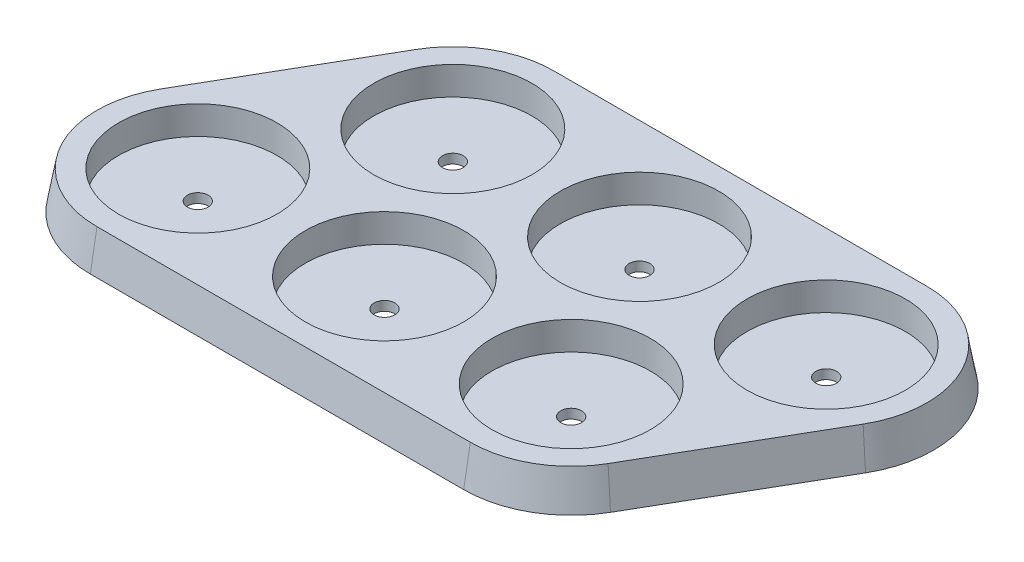
ISO-10303-21;
HEADER;
FILE_DESCRIPTION(('STEP AP214'),'2;1');
FILE_NAME('part.step','',(''),(''),'','','');
FILE_SCHEMA(('AUTOMOTIVE_DESIGN { 1 0 10303 214 1 1 1 1 }'));
ENDSEC;
DATA;
#1=APPLICATION_CONTEXT('core data for automotive mechanical design processes');
#2=APPLICATION_PROTOCOL_DEFINITION('international standard','automotive_design',2000,#1);
#3=PRODUCT_CONTEXT('',#1,'mechanical');
#4=PRODUCT('Part','Part','',(#3));
#5=PRODUCT_RELATED_PRODUCT_CATEGORY('part','',(#4));
#6=PRODUCT_DEFINITION_FORMATION('','',#4);
#7=PRODUCT_DEFINITION_CONTEXT('part definition',#1,'design');
#8=PRODUCT_DEFINITION('design','',#6,#7);
#9=PRODUCT_DEFINITION_SHAPE('','',#8);
#10=(LENGTH_UNIT() NAMED_UNIT(*) SI_UNIT(.MILLI.,.METRE.));
#11=(NAMED_UNIT(*) PLANE_ANGLE_UNIT() SI_UNIT($,.RADIAN.));
#12=(NAMED_UNIT(*) SI_UNIT($,.STERADIAN.) SOLID_ANGLE_UNIT());
#13=UNCERTAINTY_MEASURE_WITH_UNIT(LENGTH_MEASURE(1.E-05),#10,'distance_accuracy_value','');
#14=(GEOMETRIC_REPRESENTATION_CONTEXT(3) GLOBAL_UNCERTAINTY_ASSIGNED_CONTEXT((#13)) GLOBAL_UNIT_ASSIGNED_CONTEXT((#10,
#11,#12)) REPRESENTATION_CONTEXT('',''));
#15=CARTESIAN_POINT('',(0.,0.,0.));
#16=DIRECTION('',(0.,0.,1.));
#17=DIRECTION('',(1.,0.,0.));
#18=AXIS2_PLACEMENT_3D('',#15,#16,#17);
#19=CARTESIAN_POINT('',(-9.90000000000008,0.,17.1473029949318));
#20=DIRECTION('',(0.,1.,0.));
#21=DIRECTION('',(0.,0.,1.));
#22=AXIS2_PLACEMENT_3D('',#19,#20,#21);
#23=CYLINDRICAL_SURFACE('',#22,1.1);
#24=CARTESIAN_POINT('',(-9.90000000000008,0.,17.1473029949318));
#25=DIRECTION('',(0.,1.,0.));
#26=DIRECTION('',(0.,0.,1.));
#27=AXIS2_PLACEMENT_3D('',#24,#25,#26);
#28=CIRCLE('',#27,1.1);
#29=CARTESIAN_POINT('',(-9.90000000000008,0.,18.2473029949318));
#30=VERTEX_POINT('',#29);
#31=EDGE_CURVE('E192',#30,#30,#28,.T.);
#32=ORIENTED_EDGE('',*,*,#31,.F.);
#33=EDGE_LOOP('',(#32));
#34=FACE_BOUND('',#33,.T.);
#35=CARTESIAN_POINT('',(-9.90000000000008,1.,17.1473029949318));
#36=DIRECTION('',(0.,1.,0.));
#37=DIRECTION('',(0.,0.,1.));
#38=AXIS2_PLACEMENT_3D('',#35,#36,#37);
#39=CIRCLE('',#38,1.1);
#40=CARTESIAN_POINT('',(-9.90000000000008,1.,18.2473029949318));
#41=VERTEX_POINT('',#40);
#42=EDGE_CURVE('E627',#41,#41,#39,.T.);
#43=ORIENTED_EDGE('',*,*,#42,.T.);
#44=EDGE_LOOP('',(#43));
#45=FACE_BOUND('',#44,.T.);
#46=ADVANCED_FACE('F104',(#34,#45),#23,.F.);
#47=CARTESIAN_POINT('',(-19.7999999999998,0.,0.));
#48=DIRECTION('',(0.,1.,0.));
#49=DIRECTION('',(0.,0.,1.));
#50=AXIS2_PLACEMENT_3D('',#47,#48,#49);
#51=CYLINDRICAL_SURFACE('',#50,1.10000000000001);
#52=CARTESIAN_POINT('',(-19.7999999999998,0.,0.));
#53=DIRECTION('',(0.,1.,0.));
#54=DIRECTION('',(0.,0.,1.));
#55=AXIS2_PLACEMENT_3D('',#52,#53,#54);
#56=CIRCLE('',#55,1.10000000000001);
#57=CARTESIAN_POINT('',(-19.7999999999998,0.,1.10000000000001));
#58=VERTEX_POINT('',#57);
#59=EDGE_CURVE('E659',#58,#58,#56,.T.);
#60=ORIENTED_EDGE('',*,*,#59,.F.);
#61=EDGE_LOOP('',(#60));
#62=FACE_BOUND('',#61,.T.);
#63=CARTESIAN_POINT('',(-19.7999999999998,1.,0.));
#64=DIRECTION('',(0.,1.,0.));
#65=DIRECTION('',(0.,0.,1.));
#66=AXIS2_PLACEMENT_3D('',#63,#64,#65);
#67=CIRCLE('',#66,1.10000000000001);
#68=CARTESIAN_POINT('',(-19.7999999999998,1.,1.10000000000001));
#69=VERTEX_POINT('',#68);
#70=EDGE_CURVE('E649',#69,#69,#67,.T.);
#71=ORIENTED_EDGE('',*,*,#70,.T.);
#72=EDGE_LOOP('',(#71));
#73=FACE_BOUND('',#72,.T.);
#74=ADVANCED_FACE('F287',(#62,#73),#51,.F.);
#75=CARTESIAN_POINT('',(-49.4999999999999,0.,17.1473029949316));
#76=DIRECTION('',(0.,1.,0.));
#77=DIRECTION('',(0.,0.,1.));
#78=AXIS2_PLACEMENT_3D('',#75,#76,#77);
#79=CYLINDRICAL_SURFACE('',#78,1.1);
#80=CARTESIAN_POINT('',(-49.4999999999999,0.,17.1473029949316));
#81=DIRECTION('',(0.,1.,0.));
#82=DIRECTION('',(0.,0.,1.));
#83=AXIS2_PLACEMENT_3D('',#80,#81,#82);
#84=CIRCLE('',#83,1.1);
#85=CARTESIAN_POINT('',(-49.4999999999999,0.,18.2473029949316));
#86=VERTEX_POINT('',#85);
#87=EDGE_CURVE('E666',#86,#86,#84,.T.);
#88=ORIENTED_EDGE('',*,*,#87,.F.);
#89=EDGE_LOOP('',(#88));
#90=FACE_BOUND('',#89,.T.);
#91=CARTESIAN_POINT('',(-49.4999999999999,1.,17.1473029949316));
#92=DIRECTION('',(0.,1.,0.));
#93=DIRECTION('',(0.,0.,1.));
#94=AXIS2_PLACEMENT_3D('',#91,#92,#93);
#95=CIRCLE('',#94,1.1);
#96=CARTESIAN_POINT('',(-49.4999999999999,1.,18.2473029949316));
#97=VERTEX_POINT('',#96);
#98=EDGE_CURVE('E684',#97,#97,#95,.T.);
#99=ORIENTED_EDGE('',*,*,#98,.T.);
#100=EDGE_LOOP('',(#99));
#101=FACE_BOUND('',#100,.T.);
#102=ADVANCED_FACE('F293',(#90,#101),#79,.F.);
#103=CARTESIAN_POINT('',(-39.5999999999999,0.,-2.72581957005969E-13));
#104=DIRECTION('',(0.,1.,0.));
#105=DIRECTION('',(0.,0.,1.));
#106=AXIS2_PLACEMENT_3D('',#103,#104,#105);
#107=CYLINDRICAL_SURFACE('',#106,1.10000000000001);
#108=CARTESIAN_POINT('',(-39.5999999999999,0.,-2.72581957005969E-13));
#109=DIRECTION('',(0.,1.,0.));
#110=DIRECTION('',(0.,0.,1.));
#111=AXIS2_PLACEMENT_3D('',#108,#109,#110);
#112=CIRCLE('',#111,1.10000000000001);
#113=CARTESIAN_POINT('',(-39.5999999999999,0.,1.09999999999974));
#114=VERTEX_POINT('',#113);
#115=EDGE_CURVE('E673',#114,#114,#112,.T.);
#116=ORIENTED_EDGE('',*,*,#115,.F.);
#117=EDGE_LOOP('',(#116));
#118=FACE_BOUND('',#117,.T.);
#119=CARTESIAN_POINT('',(-39.5999999999999,1.,-2.72581957005969E-13));
#120=DIRECTION('',(0.,1.,0.));
#121=DIRECTION('',(0.,0.,1.));
#122=AXIS2_PLACEMENT_3D('',#119,#120,#121);
#123=CIRCLE('',#122,1.10000000000001);
#124=CARTESIAN_POINT('',(-39.5999999999999,1.,1.09999999999974));
#125=VERTEX_POINT('',#124);
#126=EDGE_CURVE('E637',#125,#125,#123,.T.);
#127=ORIENTED_EDGE('',*,*,#126,.T.);
#128=EDGE_LOOP('',(#127));
#129=FACE_BOUND('',#128,.T.);
#130=ADVANCED_FACE('F477',(#118,#129),#107,.F.);
#131=CARTESIAN_POINT('',(-29.6999999999999,0.,17.1473029949318));
#132=DIRECTION('',(0.,1.,0.));
#133=DIRECTION('',(0.,0.,1.));
#134=AXIS2_PLACEMENT_3D('',#131,#132,#133);
#135=CYLINDRICAL_SURFACE('',#134,1.1);
#136=CARTESIAN_POINT('',(-29.6999999999999,0.,17.1473029949318));
#137=DIRECTION('',(0.,1.,0.));
#138=DIRECTION('',(0.,0.,1.));
#139=AXIS2_PLACEMENT_3D('',#136,#137,#138);
#140=CIRCLE('',#139,1.1);
#141=CARTESIAN_POINT('',(-29.6999999999999,0.,18.2473029949318));
#142=VERTEX_POINT('',#141);
#143=EDGE_CURVE('E669',#142,#142,#140,.T.);
#144=ORIENTED_EDGE('',*,*,#143,.F.);
#145=EDGE_LOOP('',(#144));
#146=FACE_BOUND('',#145,.T.);
#147=CARTESIAN_POINT('',(-29.6999999999999,1.,17.1473029949318));
#148=DIRECTION('',(0.,1.,0.));
#149=DIRECTION('',(0.,0.,1.));
#150=AXIS2_PLACEMENT_3D('',#147,#148,#149);
#151=CIRCLE('',#150,1.1);
#152=CARTESIAN_POINT('',(-29.6999999999999,1.,18.2473029949318));
#153=VERTEX_POINT('',#152);
#154=EDGE_CURVE('E629',#153,#153,#151,.T.);
#155=ORIENTED_EDGE('',*,*,#154,.T.);
#156=EDGE_LOOP('',(#155));
#157=FACE_BOUND('',#156,.T.);
#158=ADVANCED_FACE('F485',(#146,#157),#135,.F.);
#159=CARTESIAN_POINT('',(0.,0.,0.));
#160=DIRECTION('',(0.,1.,0.));
#161=DIRECTION('',(0.,0.,1.));
#162=AXIS2_PLACEMENT_3D('',#159,#160,#161);
#163=CYLINDRICAL_SURFACE('',#162,1.1);
#164=CARTESIAN_POINT('',(0.,0.,0.));
#165=DIRECTION('',(0.,1.,0.));
#166=DIRECTION('',(0.,0.,1.));
#167=AXIS2_PLACEMENT_3D('',#164,#165,#166);
#168=CIRCLE('',#167,1.1);
#169=CARTESIAN_POINT('',(0.,0.,1.1));
#170=VERTEX_POINT('',#169);
#171=EDGE_CURVE('E196',#170,#170,#168,.T.);
#172=ORIENTED_EDGE('',*,*,#171,.F.);
#173=EDGE_LOOP('',(#172));
#174=FACE_BOUND('',#173,.T.);
#175=CARTESIAN_POINT('',(0.,1.,0.));
#176=DIRECTION('',(0.,1.,0.));
#177=DIRECTION('',(0.,0.,1.));
#178=AXIS2_PLACEMENT_3D('',#175,#176,#177);
#179=CIRCLE('',#178,1.1);
#180=CARTESIAN_POINT('',(0.,1.,1.1));
#181=VERTEX_POINT('',#180);
#182=EDGE_CURVE('E608',#181,#181,#179,.T.);
#183=ORIENTED_EDGE('',*,*,#182,.T.);
#184=EDGE_LOOP('',(#183));
#185=FACE_BOUND('',#184,.T.);
#186=ADVANCED_FACE('F313',(#174,#185),#163,.F.);
#187=CARTESIAN_POINT('',(-9.90000000000008,0.,17.1473029949318));
#188=DIRECTION('',(0.,-1.,0.));
#189=DIRECTION('',(0.,0.,1.));
#190=AXIS2_PLACEMENT_3D('',#187,#188,#189);
#191=CONICAL_SURFACE('',#190,11.4,0.174532925199433);
#192=CARTESIAN_POINT('',(-9.90000000000008,0.,17.1473029949318));
#193=DIRECTION('',(0.,1.,0.));
#194=DIRECTION('',(0.,0.,1.));
#195=AXIS2_PLACEMENT_3D('',#192,#193,#194);
#196=CIRCLE('',#195,11.4);
#197=CARTESIAN_POINT('',(-9.90000000000008,0.,28.5473029949318));
#198=VERTEX_POINT('',#197);
#199=CARTESIAN_POINT('',(-0.0273103968575052,0.,22.8473029949319));
#200=VERTEX_POINT('',#199);
#201=EDGE_CURVE('E217',#198,#200,#196,.T.);
#202=ORIENTED_EDGE('',*,*,#201,.T.);
#203=DIRECTION('',(0.150383733180435,-0.984807753012208,0.0868240888334661));
#204=VECTOR('',#203,1.);
#205=CARTESIAN_POINT('',(-0.0273103968575027,0.,22.8473029949319));
#206=LINE('',#205,#204);
#207=CARTESIAN_POINT('',(-0.63812497552206,4.,22.494649033515));
#208=VERTEX_POINT('',#207);
#209=EDGE_CURVE('E189',#208,#200,#206,.T.);
#210=ORIENTED_EDGE('',*,*,#209,.F.);
#211=CARTESIAN_POINT('',(-9.90000000000008,4.,17.1473029949318));
#212=DIRECTION('',(0.,1.,0.));
#213=DIRECTION('',(0.,0.,1.));
#214=AXIS2_PLACEMENT_3D('',#211,#212,#213);
#215=CIRCLE('',#214,10.6946920771661);
#216=CARTESIAN_POINT('',(-9.90000000000008,4.,27.841995072098));
#217=VERTEX_POINT('',#216);
#218=EDGE_CURVE('E108',#217,#208,#215,.T.);
#219=ORIENTED_EDGE('',*,*,#218,.F.);
#220=DIRECTION('',(0.,-0.984807753012208,0.173648177666931));
#221=VECTOR('',#220,1.);
#222=CARTESIAN_POINT('',(-9.90000000000008,0.,28.5473029949318));
#223=LINE('',#222,#221);
#224=EDGE_CURVE('E129',#217,#198,#223,.T.);
#225=ORIENTED_EDGE('',*,*,#224,.T.);
#226=EDGE_LOOP('',(#202,#210,#219,#225));
#227=FACE_BOUND('',#226,.T.);
#228=ADVANCED_FACE('F310',(#227),#191,.T.);
#229=CARTESIAN_POINT('',(9.87268960314258,0.,5.70000000000005));
#230=DIRECTION('',(0.852868531952441,0.173648177666931,0.492403876506108));
#231=DIRECTION('',(0.500000000000004,0.,-0.866025403784436));
#232=AXIS2_PLACEMENT_3D('',#229,#230,#231);
#233=PLANE('',#232);
#234=DIRECTION('',(-0.500000000000004,0.,0.866025403784436));
#235=VECTOR('',#234,1.);
#236=CARTESIAN_POINT('',(9.87268960314258,0.,5.70000000000005));
#237=LINE('',#236,#235);
#238=CARTESIAN_POINT('',(9.87268960314258,0.,5.70000000000005));
#239=VERTEX_POINT('',#238);
#240=EDGE_CURVE('E183',#239,#200,#237,.T.);
#241=ORIENTED_EDGE('',*,*,#240,.F.);
#242=DIRECTION('',(0.150383733180435,-0.984807753012208,0.0868240888334661));
#243=VECTOR('',#242,1.);
#244=CARTESIAN_POINT('',(9.87268960314258,0.,5.70000000000004));
#245=LINE('',#244,#243);
#246=CARTESIAN_POINT('',(9.26187502447802,4.,5.34734603858311));
#247=VERTEX_POINT('',#246);
#248=EDGE_CURVE('E12',#247,#239,#245,.T.);
#249=ORIENTED_EDGE('',*,*,#248,.F.);
#250=DIRECTION('',(-0.500000000000004,0.,0.866025403784436));
#251=VECTOR('',#250,1.);
#252=CARTESIAN_POINT('',(9.26187502447802,4.,5.34734603858312));
#253=LINE('',#252,#251);
#254=EDGE_CURVE('E219',#247,#208,#253,.T.);
#255=ORIENTED_EDGE('',*,*,#254,.T.);
#256=ORIENTED_EDGE('',*,*,#209,.T.);
#257=EDGE_LOOP('',(#241,#249,#255,#256));
#258=FACE_BOUND('',#257,.T.);
#259=ADVANCED_FACE('F188',(#258),#233,.T.);
#260=CARTESIAN_POINT('',(0.,0.,0.));
#261=DIRECTION('',(0.,-1.,0.));
#262=DIRECTION('',(0.,0.,1.));
#263=AXIS2_PLACEMENT_3D('',#260,#261,#262);
#264=CONICAL_SURFACE('',#263,11.4,0.174532925199433);
#265=CARTESIAN_POINT('',(0.,0.,0.));
#266=DIRECTION('',(0.,1.,0.));
#267=DIRECTION('',(0.,0.,1.));
#268=AXIS2_PLACEMENT_3D('',#265,#266,#267);
#269=CIRCLE('',#268,11.4);
#270=CARTESIAN_POINT('',(0.,0.,-11.4));
#271=VERTEX_POINT('',#270);
#272=EDGE_CURVE('E172',#239,#271,#269,.T.);
#273=ORIENTED_EDGE('',*,*,#272,.T.);
#274=DIRECTION('',(0.,-0.984807753012208,-0.173648177666931));
#275=VECTOR('',#274,1.);
#276=CARTESIAN_POINT('',(0.,0.,-11.3999999999997));
#277=LINE('',#276,#275);
#278=CARTESIAN_POINT('',(0.,4.,-10.6946920771659));
#279=VERTEX_POINT('',#278);
#280=EDGE_CURVE('E114',#279,#271,#277,.T.);
#281=ORIENTED_EDGE('',*,*,#280,.F.);
#282=CARTESIAN_POINT('',(0.,4.,0.));
#283=DIRECTION('',(0.,1.,0.));
#284=DIRECTION('',(0.,0.,1.));
#285=AXIS2_PLACEMENT_3D('',#282,#283,#284);
#286=CIRCLE('',#285,10.6946920771661);
#287=EDGE_CURVE('E174',#247,#279,#286,.T.);
#288=ORIENTED_EDGE('',*,*,#287,.F.);
#289=ORIENTED_EDGE('',*,*,#248,.T.);
#290=EDGE_LOOP('',(#273,#281,#288,#289));
#291=FACE_BOUND('',#290,.T.);
#292=ADVANCED_FACE('F106',(#291),#264,.T.);
#293=CARTESIAN_POINT('',(1.57807268935826E-13,0.,-11.3999999999997));
#294=DIRECTION('',(0.,0.173648177666931,-0.984807753012208));
#295=DIRECTION('',(0.,0.984807753012208,0.173648177666931));
#296=AXIS2_PLACEMENT_3D('',#293,#294,#295);
#297=PLANE('',#296);
#298=DIRECTION('',(-1.,0.,0.));
#299=VECTOR('',#298,1.);
#300=CARTESIAN_POINT('',(1.57807268935826E-13,0.,-11.3999999999997));
#301=LINE('',#300,#299);
#302=CARTESIAN_POINT('',(-39.5999999999999,0.,-11.4000000000003));
#303=VERTEX_POINT('',#302);
#304=EDGE_CURVE('E185',#271,#303,#301,.T.);
#305=ORIENTED_EDGE('',*,*,#304,.T.);
#306=DIRECTION('',(0.,-0.984807753012208,-0.173648177666931));
#307=VECTOR('',#306,1.);
#308=CARTESIAN_POINT('',(-39.5999999999999,0.,-11.4000000000003));
#309=LINE('',#308,#307);
#310=CARTESIAN_POINT('',(-39.5999999999999,4.,-10.6946920771664));
#311=VERTEX_POINT('',#310);
#312=EDGE_CURVE('E235',#311,#303,#309,.T.);
#313=ORIENTED_EDGE('',*,*,#312,.F.);
#314=DIRECTION('',(1.,0.,0.));
#315=VECTOR('',#314,1.);
#316=CARTESIAN_POINT('',(1.48043872702386E-13,4.,-10.6946920771659));
#317=LINE('',#316,#315);
#318=EDGE_CURVE('E245',#279,#311,#317,.F.);
#319=ORIENTED_EDGE('',*,*,#318,.F.);
#320=ORIENTED_EDGE('',*,*,#280,.T.);
#321=EDGE_LOOP('',(#305,#313,#319,#320));
#322=FACE_BOUND('',#321,.T.);
#323=ADVANCED_FACE('F279',(#322),#297,.T.);
#324=CARTESIAN_POINT('',(-39.5999999999999,0.,-2.72581957005969E-13));
#325=DIRECTION('',(0.,-1.,0.));
#326=DIRECTION('',(0.,0.,1.));
#327=AXIS2_PLACEMENT_3D('',#324,#325,#326);
#328=CONICAL_SURFACE('',#327,11.4,0.174532925199433);
#329=CARTESIAN_POINT('',(-39.5999999999999,0.,-2.72581957005969E-13));
#330=DIRECTION('',(0.,1.,0.));
#331=DIRECTION('',(0.,0.,1.));
#332=AXIS2_PLACEMENT_3D('',#329,#330,#331);
#333=CIRCLE('',#332,11.4);
#334=CARTESIAN_POINT('',(-49.4726896031424,0.,-5.70000000000031));
#335=VERTEX_POINT('',#334);
#336=EDGE_CURVE('E202',#303,#335,#333,.T.);
#337=ORIENTED_EDGE('',*,*,#336,.T.);
#338=DIRECTION('',(-0.150383733180435,-0.984807753012208,-0.086824088833466));
#339=VECTOR('',#338,1.);
#340=CARTESIAN_POINT('',(-49.4726896031424,0.,-5.7000000000003));
#341=LINE('',#340,#339);
#342=CARTESIAN_POINT('',(-48.8618750244779,4.,-5.34734603858337));
#343=VERTEX_POINT('',#342);
#344=EDGE_CURVE('E232',#343,#335,#341,.T.);
#345=ORIENTED_EDGE('',*,*,#344,.F.);
#346=CARTESIAN_POINT('',(-39.5999999999999,4.,-2.72581957005969E-13));
#347=DIRECTION('',(0.,1.,0.));
#348=DIRECTION('',(0.,0.,1.));
#349=AXIS2_PLACEMENT_3D('',#346,#347,#348);
#350=CIRCLE('',#349,10.6946920771662);
#351=EDGE_CURVE('E248',#311,#343,#350,.T.);
#352=ORIENTED_EDGE('',*,*,#351,.F.);
#353=ORIENTED_EDGE('',*,*,#312,.T.);
#354=EDGE_LOOP('',(#337,#345,#352,#353));
#355=FACE_BOUND('',#354,.T.);
#356=ADVANCED_FACE('F275',(#355),#328,.T.);
#357=CARTESIAN_POINT('',(-39.5726896031425,0.,-22.847302994932));
#358=DIRECTION('',(-0.852868531952441,0.173648177666931,-0.492403876506108));
#359=DIRECTION('',(-0.500000000000004,0.,0.866025403784437));
#360=AXIS2_PLACEMENT_3D('',#357,#358,#359);
#361=PLANE('',#360);
#362=DIRECTION('',(0.500000000000004,0.,-0.866025403784437));
#363=VECTOR('',#362,1.);
#364=CARTESIAN_POINT('',(-39.5726896031425,0.,-22.847302994932));
#365=LINE('',#364,#363);
#366=CARTESIAN_POINT('',(-59.3726896031425,0.,11.4473029949315));
#367=VERTEX_POINT('',#366);
#368=EDGE_CURVE('E206',#367,#335,#365,.T.);
#369=ORIENTED_EDGE('',*,*,#368,.F.);
#370=DIRECTION('',(-0.150383733180435,-0.984807753012208,-0.0868240888334659));
#371=VECTOR('',#370,1.);
#372=CARTESIAN_POINT('',(-59.3726896031425,0.,11.4473029949315));
#373=LINE('',#372,#371);
#374=CARTESIAN_POINT('',(-58.761875024478,4.,11.7999569563485));
#375=VERTEX_POINT('',#374);
#376=EDGE_CURVE('E229',#375,#367,#373,.T.);
#377=ORIENTED_EDGE('',*,*,#376,.F.);
#378=DIRECTION('',(0.500000000000004,0.,-0.866025403784437));
#379=VECTOR('',#378,1.);
#380=CARTESIAN_POINT('',(-38.9618750244779,4.,-22.4946490335151));
#381=LINE('',#380,#379);
#382=EDGE_CURVE('E251',#375,#343,#381,.T.);
#383=ORIENTED_EDGE('',*,*,#382,.T.);
#384=ORIENTED_EDGE('',*,*,#344,.T.);
#385=EDGE_LOOP('',(#369,#377,#383,#384));
#386=FACE_BOUND('',#385,.T.);
#387=ADVANCED_FACE('F271',(#386),#361,.T.);
#388=CARTESIAN_POINT('',(-49.4999999999999,0.,17.1473029949316));
#389=DIRECTION('',(0.,-1.,0.));
#390=DIRECTION('',(0.,0.,1.));
#391=AXIS2_PLACEMENT_3D('',#388,#389,#390);
#392=CONICAL_SURFACE('',#391,11.4,0.174532925199433);
#393=CARTESIAN_POINT('',(-49.4999999999999,0.,17.1473029949316));
#394=DIRECTION('',(0.,1.,0.));
#395=DIRECTION('',(0.,0.,1.));
#396=AXIS2_PLACEMENT_3D('',#393,#394,#395);
#397=CIRCLE('',#396,11.4);
#398=CARTESIAN_POINT('',(-49.5000000000001,0.,28.5473029949316));
#399=VERTEX_POINT('',#398);
#400=EDGE_CURVE('E210',#367,#399,#397,.T.);
#401=ORIENTED_EDGE('',*,*,#400,.T.);
#402=DIRECTION('',(0.,-0.984807753012208,0.173648177666931));
#403=VECTOR('',#402,1.);
#404=CARTESIAN_POINT('',(-49.5000000000001,0.,28.5473029949316));
#405=LINE('',#404,#403);
#406=CARTESIAN_POINT('',(-49.5000000000001,4.,27.8419950720977));
#407=VERTEX_POINT('',#406);
#408=EDGE_CURVE('E225',#407,#399,#405,.T.);
#409=ORIENTED_EDGE('',*,*,#408,.F.);
#410=CARTESIAN_POINT('',(-49.4999999999999,4.,17.1473029949316));
#411=DIRECTION('',(0.,1.,0.));
#412=DIRECTION('',(0.,0.,1.));
#413=AXIS2_PLACEMENT_3D('',#410,#411,#412);
#414=CIRCLE('',#413,10.6946920771661);
#415=EDGE_CURVE('E255',#375,#407,#414,.T.);
#416=ORIENTED_EDGE('',*,*,#415,.F.);
#417=ORIENTED_EDGE('',*,*,#376,.T.);
#418=EDGE_LOOP('',(#401,#409,#416,#417));
#419=FACE_BOUND('',#418,.T.);
#420=ADVANCED_FACE('F267',(#419),#392,.T.);
#421=CARTESIAN_POINT('',(-3.80166406845053E-13,0.,28.5473029949322));
#422=DIRECTION('',(0.,0.173648177666931,0.984807753012208));
#423=DIRECTION('',(0.,-0.984807753012208,0.173648177666931));
#424=AXIS2_PLACEMENT_3D('',#421,#422,#423);
#425=PLANE('',#424);
#426=DIRECTION('',(-1.,0.,0.));
#427=VECTOR('',#426,1.);
#428=CARTESIAN_POINT('',(-3.70773772493896E-13,4.,27.8419950720984));
#429=LINE('',#428,#427);
#430=EDGE_CURVE('E258',#217,#407,#429,.T.);
#431=ORIENTED_EDGE('',*,*,#430,.T.);
#432=ORIENTED_EDGE('',*,*,#408,.T.);
#433=DIRECTION('',(-1.,0.,0.));
#434=VECTOR('',#433,1.);
#435=CARTESIAN_POINT('',(-3.80166406845053E-13,0.,28.5473029949322));
#436=LINE('',#435,#434);
#437=EDGE_CURVE('E214',#198,#399,#436,.T.);
#438=ORIENTED_EDGE('',*,*,#437,.F.);
#439=ORIENTED_EDGE('',*,*,#224,.F.);
#440=EDGE_LOOP('',(#431,#432,#438,#439));
#441=FACE_BOUND('',#440,.T.);
#442=ADVANCED_FACE('F261',(#441),#425,.T.);
#443=CARTESIAN_POINT('',(0.,0.,0.));
#444=DIRECTION('',(0.,1.,0.));
#445=DIRECTION('',(0.,0.,1.));
#446=AXIS2_PLACEMENT_3D('',#443,#444,#445);
#447=PLANE('',#446);
#448=ORIENTED_EDGE('',*,*,#171,.T.);
#449=EDGE_LOOP('',(#448));
#450=FACE_BOUND('',#449,.T.);
#451=ORIENTED_EDGE('',*,*,#143,.T.);
#452=EDGE_LOOP('',(#451));
#453=FACE_BOUND('',#452,.T.);
#454=ORIENTED_EDGE('',*,*,#115,.T.);
#455=EDGE_LOOP('',(#454));
#456=FACE_BOUND('',#455,.T.);
#457=ORIENTED_EDGE('',*,*,#87,.T.);
#458=EDGE_LOOP('',(#457));
#459=FACE_BOUND('',#458,.T.);
#460=ORIENTED_EDGE('',*,*,#59,.T.);
#461=EDGE_LOOP('',(#460));
#462=FACE_BOUND('',#461,.T.);
#463=ORIENTED_EDGE('',*,*,#31,.T.);
#464=EDGE_LOOP('',(#463));
#465=FACE_BOUND('',#464,.T.);
#466=ORIENTED_EDGE('',*,*,#437,.T.);
#467=ORIENTED_EDGE('',*,*,#400,.F.);
#468=ORIENTED_EDGE('',*,*,#368,.T.);
#469=ORIENTED_EDGE('',*,*,#336,.F.);
#470=ORIENTED_EDGE('',*,*,#304,.F.);
#471=ORIENTED_EDGE('',*,*,#272,.F.);
#472=ORIENTED_EDGE('',*,*,#240,.T.);
#473=ORIENTED_EDGE('',*,*,#201,.F.);
#474=EDGE_LOOP('',(#466,#467,#468,#469,#470,#471,#472,#473));
#475=FACE_BOUND('',#474,.T.);
#476=ADVANCED_FACE('F181',(#450,#453,#456,#459,#462,#465,#475),#447,.F.);
#477=CARTESIAN_POINT('',(0.,4.,0.));
#478=DIRECTION('',(0.,1.,0.));
#479=DIRECTION('',(0.,0.,1.));
#480=AXIS2_PLACEMENT_3D('',#477,#478,#479);
#481=PLANE('',#480);
#482=CARTESIAN_POINT('',(-9.90000000000008,4.,17.1473029949318));
#483=DIRECTION('',(0.,1.,0.));
#484=DIRECTION('',(0.,0.,1.));
#485=AXIS2_PLACEMENT_3D('',#482,#483,#484);
#486=CIRCLE('',#485,8.4);
#487=CARTESIAN_POINT('',(-9.90000000000008,4.,25.5473029949318));
#488=VERTEX_POINT('',#487);
#489=EDGE_CURVE('E623',#488,#488,#486,.T.);
#490=ORIENTED_EDGE('',*,*,#489,.F.);
#491=EDGE_LOOP('',(#490));
#492=FACE_BOUND('',#491,.T.);
#493=CARTESIAN_POINT('',(0.,4.,0.));
#494=DIRECTION('',(0.,1.,0.));
#495=DIRECTION('',(0.,0.,1.));
#496=AXIS2_PLACEMENT_3D('',#493,#494,#495);
#497=CIRCLE('',#496,8.4);
#498=CARTESIAN_POINT('',(0.,4.,8.4));
#499=VERTEX_POINT('',#498);
#500=EDGE_CURVE('E610',#499,#499,#497,.T.);
#501=ORIENTED_EDGE('',*,*,#500,.F.);
#502=EDGE_LOOP('',(#501));
#503=FACE_BOUND('',#502,.T.);
#504=CARTESIAN_POINT('',(-29.6999999999999,4.,17.1473029949318));
#505=DIRECTION('',(0.,1.,0.));
#506=DIRECTION('',(0.,0.,1.));
#507=AXIS2_PLACEMENT_3D('',#504,#505,#506);
#508=CIRCLE('',#507,8.4);
#509=CARTESIAN_POINT('',(-29.6999999999999,4.,25.5473029949318));
#510=VERTEX_POINT('',#509);
#511=EDGE_CURVE('E619',#510,#510,#508,.T.);
#512=ORIENTED_EDGE('',*,*,#511,.F.);
#513=EDGE_LOOP('',(#512));
#514=FACE_BOUND('',#513,.T.);
#515=CARTESIAN_POINT('',(-39.5999999999999,4.,-2.72581957005969E-13));
#516=DIRECTION('',(0.,1.,0.));
#517=DIRECTION('',(0.,0.,1.));
#518=AXIS2_PLACEMENT_3D('',#515,#516,#517);
#519=CIRCLE('',#518,8.40000000000002);
#520=CARTESIAN_POINT('',(-39.5999999999999,4.,8.39999999999974));
#521=VERTEX_POINT('',#520);
#522=EDGE_CURVE('E641',#521,#521,#519,.T.);
#523=ORIENTED_EDGE('',*,*,#522,.F.);
#524=EDGE_LOOP('',(#523));
#525=FACE_BOUND('',#524,.T.);
#526=CARTESIAN_POINT('',(-49.4999999999999,4.,17.1473029949316));
#527=DIRECTION('',(0.,1.,0.));
#528=DIRECTION('',(0.,0.,1.));
#529=AXIS2_PLACEMENT_3D('',#526,#527,#528);
#530=CIRCLE('',#529,8.4);
#531=CARTESIAN_POINT('',(-49.4999999999999,4.,25.5473029949316));
#532=VERTEX_POINT('',#531);
#533=EDGE_CURVE('E686',#532,#532,#530,.T.);
#534=ORIENTED_EDGE('',*,*,#533,.F.);
#535=EDGE_LOOP('',(#534));
#536=FACE_BOUND('',#535,.T.);
#537=CARTESIAN_POINT('',(-19.7999999999998,4.,0.));
#538=DIRECTION('',(0.,1.,0.));
#539=DIRECTION('',(0.,0.,1.));
#540=AXIS2_PLACEMENT_3D('',#537,#538,#539);
#541=CIRCLE('',#540,8.40000000000001);
#542=CARTESIAN_POINT('',(-19.7999999999998,4.,8.40000000000001));
#543=VERTEX_POINT('',#542);
#544=EDGE_CURVE('E653',#543,#543,#541,.T.);
#545=ORIENTED_EDGE('',*,*,#544,.F.);
#546=EDGE_LOOP('',(#545));
#547=FACE_BOUND('',#546,.T.);
#548=ORIENTED_EDGE('',*,*,#415,.T.);
#549=ORIENTED_EDGE('',*,*,#430,.F.);
#550=ORIENTED_EDGE('',*,*,#218,.T.);
#551=ORIENTED_EDGE('',*,*,#254,.F.);
#552=ORIENTED_EDGE('',*,*,#287,.T.);
#553=ORIENTED_EDGE('',*,*,#318,.T.);
#554=ORIENTED_EDGE('',*,*,#351,.T.);
#555=ORIENTED_EDGE('',*,*,#382,.F.);
#556=EDGE_LOOP('',(#548,#549,#550,#551,#552,#553,#554,#555));
#557=FACE_BOUND('',#556,.T.);
#558=ADVANCED_FACE('F265',(#492,#503,#514,#525,#536,#547,#557),#481,.T.);
#559=CARTESIAN_POINT('',(0.,1.,0.));
#560=DIRECTION('',(0.,1.,0.));
#561=DIRECTION('',(0.,0.,1.));
#562=AXIS2_PLACEMENT_3D('',#559,#560,#561);
#563=CYLINDRICAL_SURFACE('',#562,8.4);
#564=CARTESIAN_POINT('',(0.,1.,0.));
#565=DIRECTION('',(0.,1.,0.));
#566=DIRECTION('',(0.,0.,1.));
#567=AXIS2_PLACEMENT_3D('',#564,#565,#566);
#568=CIRCLE('',#567,8.4);
#569=CARTESIAN_POINT('',(0.,1.,8.4));
#570=VERTEX_POINT('',#569);
#571=EDGE_CURVE('E616',#570,#570,#568,.T.);
#572=ORIENTED_EDGE('',*,*,#571,.F.);
#573=EDGE_LOOP('',(#572));
#574=FACE_BOUND('',#573,.T.);
#575=ORIENTED_EDGE('',*,*,#500,.T.);
#576=EDGE_LOOP('',(#575));
#577=FACE_BOUND('',#576,.T.);
#578=ADVANCED_FACE('F303',(#574,#577),#563,.F.);
#579=CARTESIAN_POINT('',(0.,1.,0.));
#580=DIRECTION('',(0.,1.,0.));
#581=DIRECTION('',(0.,0.,1.));
#582=AXIS2_PLACEMENT_3D('',#579,#580,#581);
#583=PLANE('',#582);
#584=ORIENTED_EDGE('',*,*,#182,.F.);
#585=EDGE_LOOP('',(#584));
#586=FACE_BOUND('',#585,.T.);
#587=ORIENTED_EDGE('',*,*,#571,.T.);
#588=EDGE_LOOP('',(#587));
#589=FACE_BOUND('',#588,.T.);
#590=ADVANCED_FACE('F347',(#586,#589),#583,.T.);
#591=CARTESIAN_POINT('',(-29.6999999999999,1.,17.1473029949318));
#592=DIRECTION('',(0.,1.,0.));
#593=DIRECTION('',(0.,0.,1.));
#594=AXIS2_PLACEMENT_3D('',#591,#592,#593);
#595=CYLINDRICAL_SURFACE('',#594,8.4);
#596=CARTESIAN_POINT('',(-29.6999999999999,1.,17.1473029949318));
#597=DIRECTION('',(0.,1.,0.));
#598=DIRECTION('',(0.,0.,1.));
#599=AXIS2_PLACEMENT_3D('',#596,#597,#598);
#600=CIRCLE('',#599,8.4);
#601=CARTESIAN_POINT('',(-29.6999999999999,1.,25.5473029949318));
#602=VERTEX_POINT('',#601);
#603=EDGE_CURVE('E611',#602,#602,#600,.T.);
#604=ORIENTED_EDGE('',*,*,#603,.F.);
#605=EDGE_LOOP('',(#604));
#606=FACE_BOUND('',#605,.T.);
#607=ORIENTED_EDGE('',*,*,#511,.T.);
#608=EDGE_LOOP('',(#607));
#609=FACE_BOUND('',#608,.T.);
#610=ADVANCED_FACE('F355',(#606,#609),#595,.F.);
#611=CARTESIAN_POINT('',(-29.6999999999999,1.,17.1473029949318));
#612=DIRECTION('',(0.,1.,0.));
#613=DIRECTION('',(0.,0.,1.));
#614=AXIS2_PLACEMENT_3D('',#611,#612,#613);
#615=PLANE('',#614);
#616=ORIENTED_EDGE('',*,*,#154,.F.);
#617=EDGE_LOOP('',(#616));
#618=FACE_BOUND('',#617,.T.);
#619=ORIENTED_EDGE('',*,*,#603,.T.);
#620=EDGE_LOOP('',(#619));
#621=FACE_BOUND('',#620,.T.);
#622=ADVANCED_FACE('F363',(#618,#621),#615,.T.);
#623=CARTESIAN_POINT('',(-39.5999999999999,1.,-2.72581957005969E-13));
#624=DIRECTION('',(0.,1.,0.));
#625=DIRECTION('',(0.,0.,1.));
#626=AXIS2_PLACEMENT_3D('',#623,#624,#625);
#627=CYLINDRICAL_SURFACE('',#626,8.40000000000002);
#628=CARTESIAN_POINT('',(-39.5999999999999,1.,-2.72581957005969E-13));
#629=DIRECTION('',(0.,1.,0.));
#630=DIRECTION('',(0.,0.,1.));
#631=AXIS2_PLACEMENT_3D('',#628,#629,#630);
#632=CIRCLE('',#631,8.40000000000002);
#633=CARTESIAN_POINT('',(-39.5999999999999,1.,8.39999999999974));
#634=VERTEX_POINT('',#633);
#635=EDGE_CURVE('E632',#634,#634,#632,.T.);
#636=ORIENTED_EDGE('',*,*,#635,.F.);
#637=EDGE_LOOP('',(#636));
#638=FACE_BOUND('',#637,.T.);
#639=ORIENTED_EDGE('',*,*,#522,.T.);
#640=EDGE_LOOP('',(#639));
#641=FACE_BOUND('',#640,.T.);
#642=ADVANCED_FACE('F371',(#638,#641),#627,.F.);
#643=CARTESIAN_POINT('',(-39.5999999999999,1.,-2.72581957005969E-13));
#644=DIRECTION('',(0.,1.,0.));
#645=DIRECTION('',(0.,0.,1.));
#646=AXIS2_PLACEMENT_3D('',#643,#644,#645);
#647=PLANE('',#646);
#648=ORIENTED_EDGE('',*,*,#126,.F.);
#649=EDGE_LOOP('',(#648));
#650=FACE_BOUND('',#649,.T.);
#651=ORIENTED_EDGE('',*,*,#635,.T.);
#652=EDGE_LOOP('',(#651));
#653=FACE_BOUND('',#652,.T.);
#654=ADVANCED_FACE('F379',(#650,#653),#647,.T.);
#655=CARTESIAN_POINT('',(-49.4999999999999,1.,17.1473029949316));
#656=DIRECTION('',(0.,1.,0.));
#657=DIRECTION('',(0.,0.,1.));
#658=AXIS2_PLACEMENT_3D('',#655,#656,#657);
#659=CYLINDRICAL_SURFACE('',#658,8.4);
#660=CARTESIAN_POINT('',(-49.4999999999999,1.,17.1473029949316));
#661=DIRECTION('',(0.,1.,0.));
#662=DIRECTION('',(0.,0.,1.));
#663=AXIS2_PLACEMENT_3D('',#660,#661,#662);
#664=CIRCLE('',#663,8.4);
#665=CARTESIAN_POINT('',(-49.4999999999999,1.,25.5473029949316));
#666=VERTEX_POINT('',#665);
#667=EDGE_CURVE('E642',#666,#666,#664,.T.);
#668=ORIENTED_EDGE('',*,*,#667,.F.);
#669=EDGE_LOOP('',(#668));
#670=FACE_BOUND('',#669,.T.);
#671=ORIENTED_EDGE('',*,*,#533,.T.);
#672=EDGE_LOOP('',(#671));
#673=FACE_BOUND('',#672,.T.);
#674=ADVANCED_FACE('F387',(#670,#673),#659,.F.);
#675=CARTESIAN_POINT('',(-49.4999999999999,1.,17.1473029949316));
#676=DIRECTION('',(0.,1.,0.));
#677=DIRECTION('',(0.,0.,1.));
#678=AXIS2_PLACEMENT_3D('',#675,#676,#677);
#679=PLANE('',#678);
#680=ORIENTED_EDGE('',*,*,#98,.F.);
#681=EDGE_LOOP('',(#680));
#682=FACE_BOUND('',#681,.T.);
#683=ORIENTED_EDGE('',*,*,#667,.T.);
#684=EDGE_LOOP('',(#683));
#685=FACE_BOUND('',#684,.T.);
#686=ADVANCED_FACE('F395',(#682,#685),#679,.T.);
#687=CARTESIAN_POINT('',(-19.7999999999998,1.,0.));
#688=DIRECTION('',(0.,1.,0.));
#689=DIRECTION('',(0.,0.,1.));
#690=AXIS2_PLACEMENT_3D('',#687,#688,#689);
#691=CYLINDRICAL_SURFACE('',#690,8.40000000000001);
#692=CARTESIAN_POINT('',(-19.7999999999998,1.,0.));
#693=DIRECTION('',(0.,1.,0.));
#694=DIRECTION('',(0.,0.,1.));
#695=AXIS2_PLACEMENT_3D('',#692,#693,#694);
#696=CIRCLE('',#695,8.40000000000001);
#697=CARTESIAN_POINT('',(-19.7999999999998,1.,8.40000000000001));
#698=VERTEX_POINT('',#697);
#699=EDGE_CURVE('E655',#698,#698,#696,.T.);
#700=ORIENTED_EDGE('',*,*,#699,.F.);
#701=EDGE_LOOP('',(#700));
#702=FACE_BOUND('',#701,.T.);
#703=ORIENTED_EDGE('',*,*,#544,.T.);
#704=EDGE_LOOP('',(#703));
#705=FACE_BOUND('',#704,.T.);
#706=ADVANCED_FACE('F403',(#702,#705),#691,.F.);
#707=CARTESIAN_POINT('',(-19.7999999999998,1.,0.));
#708=DIRECTION('',(0.,1.,0.));
#709=DIRECTION('',(0.,0.,1.));
#710=AXIS2_PLACEMENT_3D('',#707,#708,#709);
#711=PLANE('',#710);
#712=ORIENTED_EDGE('',*,*,#70,.F.);
#713=EDGE_LOOP('',(#712));
#714=FACE_BOUND('',#713,.T.);
#715=ORIENTED_EDGE('',*,*,#699,.T.);
#716=EDGE_LOOP('',(#715));
#717=FACE_BOUND('',#716,.T.);
#718=ADVANCED_FACE('F411',(#714,#717),#711,.T.);
#719=CARTESIAN_POINT('',(-9.90000000000008,1.,17.1473029949318));
#720=DIRECTION('',(0.,1.,0.));
#721=DIRECTION('',(0.,0.,1.));
#722=AXIS2_PLACEMENT_3D('',#719,#720,#721);
#723=CYLINDRICAL_SURFACE('',#722,8.4);
#724=CARTESIAN_POINT('',(-9.90000000000008,1.,17.1473029949318));
#725=DIRECTION('',(0.,1.,0.));
#726=DIRECTION('',(0.,0.,1.));
#727=AXIS2_PLACEMENT_3D('',#724,#725,#726);
#728=CIRCLE('',#727,8.4);
#729=CARTESIAN_POINT('',(-9.90000000000008,1.,25.5473029949318));
#730=VERTEX_POINT('',#729);
#731=EDGE_CURVE('E654',#730,#730,#728,.T.);
#732=ORIENTED_EDGE('',*,*,#731,.F.);
#733=EDGE_LOOP('',(#732));
#734=FACE_BOUND('',#733,.T.);
#735=ORIENTED_EDGE('',*,*,#489,.T.);
#736=EDGE_LOOP('',(#735));
#737=FACE_BOUND('',#736,.T.);
#738=ADVANCED_FACE('F419',(#734,#737),#723,.F.);
#739=CARTESIAN_POINT('',(-9.90000000000008,1.,17.1473029949318));
#740=DIRECTION('',(0.,1.,0.));
#741=DIRECTION('',(0.,0.,1.));
#742=AXIS2_PLACEMENT_3D('',#739,#740,#741);
#743=PLANE('',#742);
#744=ORIENTED_EDGE('',*,*,#42,.F.);
#745=EDGE_LOOP('',(#744));
#746=FACE_BOUND('',#745,.T.);
#747=ORIENTED_EDGE('',*,*,#731,.T.);
#748=EDGE_LOOP('',(#747));
#749=FACE_BOUND('',#748,.T.);
#750=ADVANCED_FACE('F427',(#746,#749),#743,.T.);
#751=CLOSED_SHELL('',(#46,#74,#102,#130,#158,#186,#228,#259,#292,#323,#356,#387,#420,#442,#476,
#558,#578,#590,#610,#622,#642,#654,#674,#686,#706,#718,#738,#750));
#752=MANIFOLD_SOLID_BREP('B2',#751);
#753=ADVANCED_BREP_SHAPE_REPRESENTATION('',(#18,#752),#14);
#754=SHAPE_DEFINITION_REPRESENTATION(#9,#753);
ENDSEC;
END-ISO-10303-21;
